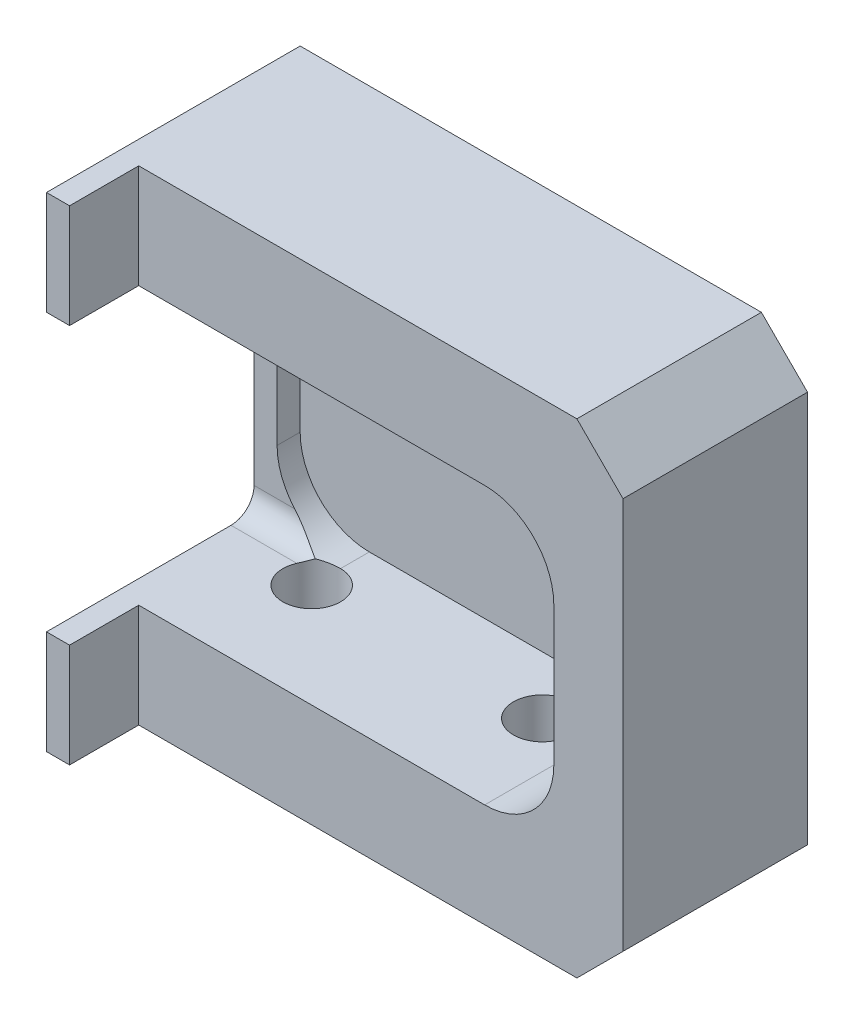
ISO-10303-21;
HEADER;
FILE_DESCRIPTION(('STEP AP214'),'2;1');
FILE_NAME('part.step','',(''),(''),'','','');
FILE_SCHEMA(('AUTOMOTIVE_DESIGN { 1 0 10303 214 1 1 1 1 }'));
ENDSEC;
DATA;
#1=APPLICATION_CONTEXT('core data for automotive mechanical design processes');
#2=APPLICATION_PROTOCOL_DEFINITION('international standard','automotive_design',2000,#1);
#3=PRODUCT_CONTEXT('',#1,'mechanical');
#4=PRODUCT('Part','Part','',(#3));
#5=PRODUCT_RELATED_PRODUCT_CATEGORY('part','',(#4));
#6=PRODUCT_DEFINITION_FORMATION('','',#4);
#7=PRODUCT_DEFINITION_CONTEXT('part definition',#1,'design');
#8=PRODUCT_DEFINITION('design','',#6,#7);
#9=PRODUCT_DEFINITION_SHAPE('','',#8);
#10=(LENGTH_UNIT() NAMED_UNIT(*) SI_UNIT(.MILLI.,.METRE.));
#11=(NAMED_UNIT(*) PLANE_ANGLE_UNIT() SI_UNIT($,.RADIAN.));
#12=(NAMED_UNIT(*) SI_UNIT($,.STERADIAN.) SOLID_ANGLE_UNIT());
#13=UNCERTAINTY_MEASURE_WITH_UNIT(LENGTH_MEASURE(1.E-05),#10,'distance_accuracy_value','');
#14=(GEOMETRIC_REPRESENTATION_CONTEXT(3) GLOBAL_UNCERTAINTY_ASSIGNED_CONTEXT((#13)) GLOBAL_UNIT_ASSIGNED_CONTEXT((#10,
#11,#12)) REPRESENTATION_CONTEXT('',''));
#15=CARTESIAN_POINT('',(0.,0.,0.));
#16=DIRECTION('',(0.,0.,1.));
#17=DIRECTION('',(1.,0.,0.));
#18=AXIS2_PLACEMENT_3D('',#15,#16,#17);
#19=CARTESIAN_POINT('',(-9.00000000000005,-3.00000000000005,1.00000000000005));
#20=DIRECTION('',(0.,0.,1.));
#21=DIRECTION('',(1.,0.,0.));
#22=AXIS2_PLACEMENT_3D('',#19,#20,#21);
#23=CYLINDRICAL_SURFACE('',#22,3.00000000000001);
#24=DIRECTION('',(0.,0.,1.));
#25=VECTOR('',#24,1.);
#26=CARTESIAN_POINT('',(-6.00000000000005,-3.00000000000001,1.00000000000005));
#27=LINE('',#26,#25);
#28=CARTESIAN_POINT('',(-6.00000000000005,-3.00000000000003,2.00000000000004));
#29=VERTEX_POINT('',#28);
#30=CARTESIAN_POINT('',(-6.00000000000002,-3.00000000000003,1.00000000000005));
#31=VERTEX_POINT('',#30);
#32=EDGE_CURVE('E194',#29,#31,#27,.F.);
#33=ORIENTED_EDGE('',*,*,#32,.T.);
#34=CARTESIAN_POINT('',(-9.00000000000005,-3.00000000000005,1.00000000000005));
#35=DIRECTION('',(0.,0.,1.));
#36=DIRECTION('',(1.,0.,0.));
#37=AXIS2_PLACEMENT_3D('',#34,#35,#36);
#38=CIRCLE('',#37,3.00000000000001);
#39=CARTESIAN_POINT('',(-9.00000000000005,-6.00000000000005,1.00000000000005));
#40=VERTEX_POINT('',#39);
#41=EDGE_CURVE('E215',#40,#31,#38,.T.);
#42=ORIENTED_EDGE('',*,*,#41,.F.);
#43=DIRECTION('',(0.,0.,1.));
#44=VECTOR('',#43,1.);
#45=CARTESIAN_POINT('',(-9.00000000000005,-6.00000000000006,1.00000000000005));
#46=LINE('',#45,#44);
#47=CARTESIAN_POINT('',(-9.00000000000005,-6.00000000000005,2.00000000000004));
#48=VERTEX_POINT('',#47);
#49=EDGE_CURVE('E196',#48,#40,#46,.F.);
#50=ORIENTED_EDGE('',*,*,#49,.F.);
#51=CARTESIAN_POINT('',(-9.00000000000005,-3.00000000000005,2.00000000000004));
#52=DIRECTION('',(0.,0.,1.));
#53=DIRECTION('',(1.,0.,0.));
#54=AXIS2_PLACEMENT_3D('',#51,#52,#53);
#55=CIRCLE('',#54,3.00000000000001);
#56=EDGE_CURVE('E19',#29,#48,#55,.F.);
#57=ORIENTED_EDGE('',*,*,#56,.F.);
#58=EDGE_LOOP('',(#33,#42,#50,#57));
#59=FACE_BOUND('',#58,.T.);
#60=ADVANCED_FACE('F16',(#59),#23,.F.);
#61=CARTESIAN_POINT('',(-6.00000000000005,2.99999999999998,1.00000000000005));
#62=DIRECTION('',(1.,0.,0.));
#63=DIRECTION('',(0.,1.,0.));
#64=AXIS2_PLACEMENT_3D('',#61,#62,#63);
#65=PLANE('',#64);
#66=DIRECTION('',(0.,0.,1.));
#67=VECTOR('',#66,1.);
#68=CARTESIAN_POINT('',(-6.00000000000004,2.99999999999995,1.00000000000005));
#69=LINE('',#68,#67);
#70=CARTESIAN_POINT('',(-6.00000000000004,2.99999999999995,2.00000000000005));
#71=VERTEX_POINT('',#70);
#72=CARTESIAN_POINT('',(-6.00000000000002,2.99999999999995,1.00000000000005));
#73=VERTEX_POINT('',#72);
#74=EDGE_CURVE('E210',#71,#73,#69,.F.);
#75=ORIENTED_EDGE('',*,*,#74,.T.);
#76=DIRECTION('',(0.,1.,0.));
#77=VECTOR('',#76,1.);
#78=CARTESIAN_POINT('',(-6.,-3.00000000000005,1.00000000000005));
#79=LINE('',#78,#77);
#80=EDGE_CURVE('E208',#31,#73,#79,.T.);
#81=ORIENTED_EDGE('',*,*,#80,.F.);
#82=ORIENTED_EDGE('',*,*,#32,.F.);
#83=DIRECTION('',(0.,1.,0.));
#84=VECTOR('',#83,1.);
#85=CARTESIAN_POINT('',(-6.00000000000005,-3.00000000000001,2.00000000000004));
#86=LINE('',#85,#84);
#87=EDGE_CURVE('E205',#71,#29,#86,.F.);
#88=ORIENTED_EDGE('',*,*,#87,.F.);
#89=EDGE_LOOP('',(#75,#81,#82,#88));
#90=FACE_BOUND('',#89,.T.);
#91=ADVANCED_FACE('F204',(#90),#65,.F.);
#92=CARTESIAN_POINT('',(-9.00000000000005,2.99999999999995,1.00000000000005));
#93=DIRECTION('',(0.,0.,1.));
#94=DIRECTION('',(1.,0.,0.));
#95=AXIS2_PLACEMENT_3D('',#92,#93,#94);
#96=CYLINDRICAL_SURFACE('',#95,3.00000000000001);
#97=DIRECTION('',(0.,0.,1.));
#98=VECTOR('',#97,1.);
#99=CARTESIAN_POINT('',(-9.00000000000005,5.99999999999996,1.00000000000005));
#100=LINE('',#99,#98);
#101=CARTESIAN_POINT('',(-9.00000000000005,5.99999999999997,1.00000000000005));
#102=VERTEX_POINT('',#101);
#103=CARTESIAN_POINT('',(-9.00000000000005,5.99999999999997,2.00000000000005));
#104=VERTEX_POINT('',#103);
#105=EDGE_CURVE('E201',#102,#104,#100,.T.);
#106=ORIENTED_EDGE('',*,*,#105,.F.);
#107=CARTESIAN_POINT('',(-9.00000000000005,2.99999999999995,1.00000000000005));
#108=DIRECTION('',(0.,0.,1.));
#109=DIRECTION('',(1.,0.,0.));
#110=AXIS2_PLACEMENT_3D('',#107,#108,#109);
#111=CIRCLE('',#110,3.00000000000001);
#112=EDGE_CURVE('E494',#73,#102,#111,.T.);
#113=ORIENTED_EDGE('',*,*,#112,.F.);
#114=ORIENTED_EDGE('',*,*,#74,.F.);
#115=CARTESIAN_POINT('',(-9.00000000000005,2.99999999999995,2.00000000000005));
#116=DIRECTION('',(0.,0.,1.));
#117=DIRECTION('',(1.,0.,0.));
#118=AXIS2_PLACEMENT_3D('',#115,#116,#117);
#119=CIRCLE('',#118,3.00000000000001);
#120=EDGE_CURVE('E200',#104,#71,#119,.F.);
#121=ORIENTED_EDGE('',*,*,#120,.F.);
#122=EDGE_LOOP('',(#106,#113,#114,#121));
#123=FACE_BOUND('',#122,.T.);
#124=ADVANCED_FACE('F369',(#123),#96,.F.);
#125=CARTESIAN_POINT('',(-6.00000000000001,-3.00000000000001,2.00000000000004));
#126=DIRECTION('',(0.,0.,1.));
#127=DIRECTION('',(1.,0.,0.));
#128=AXIS2_PLACEMENT_3D('',#125,#126,#127);
#129=PLANE('',#128);
#130=ORIENTED_EDGE('',*,*,#120,.T.);
#131=ORIENTED_EDGE('',*,*,#87,.T.);
#132=ORIENTED_EDGE('',*,*,#56,.T.);
#133=DIRECTION('',(1.,0.,0.));
#134=VECTOR('',#133,1.);
#135=CARTESIAN_POINT('',(-21.0000000000001,-6.00000000000005,2.00000000000005));
#136=LINE('',#135,#134);
#137=CARTESIAN_POINT('',(-6.00000000000003,-6.00000000000005,2.00000000000005));
#138=VERTEX_POINT('',#137);
#139=EDGE_CURVE('E238',#48,#138,#136,.T.);
#140=ORIENTED_EDGE('',*,*,#139,.T.);
#141=CARTESIAN_POINT('',(-6.00000000000001,-3.00000000000001,2.00000000000004));
#142=DIRECTION('',(0.,0.,1.));
#143=DIRECTION('',(1.,0.,0.));
#144=AXIS2_PLACEMENT_3D('',#141,#142,#143);
#145=CIRCLE('',#144,3.00000000000001);
#146=CARTESIAN_POINT('',(-3.,-3.00000000000001,2.00000000000002));
#147=VERTEX_POINT('',#146);
#148=EDGE_CURVE('E344',#138,#147,#145,.T.);
#149=ORIENTED_EDGE('',*,*,#148,.T.);
#150=DIRECTION('',(0.,1.,0.));
#151=VECTOR('',#150,1.);
#152=CARTESIAN_POINT('',(-3.,-3.,2.));
#153=LINE('',#152,#151);
#154=CARTESIAN_POINT('',(-3.00000000000002,2.99999999999998,2.));
#155=VERTEX_POINT('',#154);
#156=EDGE_CURVE('E245',#147,#155,#153,.T.);
#157=ORIENTED_EDGE('',*,*,#156,.T.);
#158=CARTESIAN_POINT('',(-6.00000000000005,2.99999999999998,2.));
#159=DIRECTION('',(0.,0.,1.));
#160=DIRECTION('',(1.,0.,0.));
#161=AXIS2_PLACEMENT_3D('',#158,#159,#160);
#162=CIRCLE('',#161,3.00000000000001);
#163=CARTESIAN_POINT('',(-6.00000000000007,5.99999999999999,2.00000000000003));
#164=VERTEX_POINT('',#163);
#165=EDGE_CURVE('E547',#155,#164,#162,.T.);
#166=ORIENTED_EDGE('',*,*,#165,.T.);
#167=DIRECTION('',(-1.,0.,0.));
#168=VECTOR('',#167,1.);
#169=CARTESIAN_POINT('',(-6.00000000000005,5.99999999999999,2.00000000000005));
#170=LINE('',#169,#168);
#171=EDGE_CURVE('E221',#164,#104,#170,.T.);
#172=ORIENTED_EDGE('',*,*,#171,.T.);
#173=EDGE_LOOP('',(#130,#131,#132,#140,#149,#157,#166,#172));
#174=FACE_BOUND('',#173,.T.);
#175=ADVANCED_FACE('F212',(#174),#129,.T.);
#176=CARTESIAN_POINT('',(-9.00000000000005,-3.00000000000005,1.00000000000005));
#177=DIRECTION('',(0.,0.,1.));
#178=DIRECTION('',(1.,0.,0.));
#179=AXIS2_PLACEMENT_3D('',#176,#177,#178);
#180=PLANE('',#179);
#181=DIRECTION('',(-1.,0.,0.));
#182=VECTOR('',#181,1.);
#183=CARTESIAN_POINT('',(-6.00000000000005,5.99999999999999,1.00000000000005));
#184=LINE('',#183,#182);
#185=CARTESIAN_POINT('',(-18.0000000000001,5.99999999999998,1.00000000000005));
#186=VERTEX_POINT('',#185);
#187=EDGE_CURVE('E223',#102,#186,#184,.T.);
#188=ORIENTED_EDGE('',*,*,#187,.T.);
#189=CARTESIAN_POINT('',(-18.0000000000001,3.,1.00000000000005));
#190=DIRECTION('',(0.,0.,-1.));
#191=DIRECTION('',(-1.,0.,0.));
#192=AXIS2_PLACEMENT_3D('',#189,#190,#191);
#193=CIRCLE('',#192,3.00000000000001);
#194=CARTESIAN_POINT('',(-21.0000000000001,3.,1.00000000000003));
#195=VERTEX_POINT('',#194);
#196=EDGE_CURVE('E348',#186,#195,#193,.F.);
#197=ORIENTED_EDGE('',*,*,#196,.T.);
#198=DIRECTION('',(0.,-1.,0.));
#199=VECTOR('',#198,1.);
#200=CARTESIAN_POINT('',(-21.0000000000001,-0.750000000000049,1.));
#201=LINE('',#200,#199);
#202=CARTESIAN_POINT('',(-21.0000000000001,-3.00000000000003,1.));
#203=VERTEX_POINT('',#202);
#204=EDGE_CURVE('E249',#195,#203,#201,.T.);
#205=ORIENTED_EDGE('',*,*,#204,.T.);
#206=CARTESIAN_POINT('',(-18.0000000000001,-3.,1.));
#207=DIRECTION('',(0.,0.,-1.));
#208=DIRECTION('',(-1.,0.,0.));
#209=AXIS2_PLACEMENT_3D('',#206,#207,#208);
#210=CIRCLE('',#209,3.00000000000001);
#211=CARTESIAN_POINT('',(-18.0000000000001,-6.00000000000005,1.00000000000003));
#212=VERTEX_POINT('',#211);
#213=EDGE_CURVE('E355',#203,#212,#210,.F.);
#214=ORIENTED_EDGE('',*,*,#213,.T.);
#215=DIRECTION('',(1.,0.,0.));
#216=VECTOR('',#215,1.);
#217=CARTESIAN_POINT('',(-21.0000000000001,-6.00000000000005,1.00000000000005));
#218=LINE('',#217,#216);
#219=EDGE_CURVE('E241',#212,#40,#218,.T.);
#220=ORIENTED_EDGE('',*,*,#219,.T.);
#221=ORIENTED_EDGE('',*,*,#41,.T.);
#222=ORIENTED_EDGE('',*,*,#80,.T.);
#223=ORIENTED_EDGE('',*,*,#112,.T.);
#224=EDGE_LOOP('',(#188,#197,#205,#214,#220,#221,#222,#223));
#225=FACE_BOUND('',#224,.T.);
#226=ADVANCED_FACE('F361',(#225),#180,.T.);
#227=CARTESIAN_POINT('',(-21.0000000000001,-5.00000000000005,3.));
#228=DIRECTION('',(-1.,0.,0.));
#229=DIRECTION('',(0.,-1.,0.));
#230=AXIS2_PLACEMENT_3D('',#227,#228,#229);
#231=CYLINDRICAL_SURFACE('',#230,1.);
#232=DIRECTION('',(1.,0.,0.));
#233=VECTOR('',#232,1.);
#234=CARTESIAN_POINT('',(-6.00000000000001,-5.00000000000005,2.00000000000004));
#235=LINE('',#234,#233);
#236=CARTESIAN_POINT('',(-22.0000000000001,-5.00000000000005,2.00000000000003));
#237=VERTEX_POINT('',#236);
#238=CARTESIAN_POINT('',(-20.2360679774999,-5.00000000000005,2.));
#239=VERTEX_POINT('',#238);
#240=EDGE_CURVE('E279',#237,#239,#235,.T.);
#241=ORIENTED_EDGE('',*,*,#240,.F.);
#242=CARTESIAN_POINT('',(-22.,-5.00000000000005,3.));
#243=DIRECTION('',(-1.,0.,0.));
#244=DIRECTION('',(0.,-1.,0.));
#245=AXIS2_PLACEMENT_3D('',#242,#243,#244);
#246=CIRCLE('',#245,1.);
#247=CARTESIAN_POINT('',(-22.0000000000001,-6.00000000000005,3.));
#248=VERTEX_POINT('',#247);
#249=EDGE_CURVE('E570',#248,#237,#246,.F.);
#250=ORIENTED_EDGE('',*,*,#249,.F.);
#251=DIRECTION('',(1.,0.,0.));
#252=VECTOR('',#251,1.);
#253=CARTESIAN_POINT('',(-21.0000000000001,-6.00000000000005,3.));
#254=LINE('',#253,#252);
#255=CARTESIAN_POINT('',(-19.145643923739,-6.00000000000003,3.00000000000001));
#256=VERTEX_POINT('',#255);
#257=EDGE_CURVE('E286',#248,#256,#254,.T.);
#258=ORIENTED_EDGE('',*,*,#257,.T.);
#259=CARTESIAN_POINT('',(-19.145643923739,-6.00000000000005,3.00000000000003));
#260=CARTESIAN_POINT('',(-19.1335860047608,-6.00000216471476,2.9723610569759));
#261=CARTESIAN_POINT('',(-19.1205337314216,-5.99885406798703,2.94519469398154));
#262=CARTESIAN_POINT('',(-19.0926011736499,-5.99451141686934,2.89203538061906));
#263=CARTESIAN_POINT('',(-19.0777235514878,-5.99131981491166,2.8660407951846));
#264=CARTESIAN_POINT('',(-19.0312448243982,-5.97923841222081,2.79117948311786));
#265=CARTESIAN_POINT('',(-18.9972410605997,-5.96781763555838,2.74417643710524));
#266=CARTESIAN_POINT('',(-18.936968961441,-5.94507011759203,2.67176859926564));
#267=CARTESIAN_POINT('',(-18.912211362201,-5.93513535403618,2.64459959512258));
#268=CARTESIAN_POINT('',(-18.8603567920642,-5.9136218621227,2.59244770382173));
#269=CARTESIAN_POINT('',(-18.8332311018124,-5.90202138192252,2.56750223452441));
#270=CARTESIAN_POINT('',(-18.8052014462808,-5.88992225343656,2.54388775193109));
#271=B_SPLINE_CURVE_WITH_KNOTS('',3,(#259,#260,#261,#262,#263,#264,#265,#266,#267,#268,#269,
#270),.UNSPECIFIED.,.F.,.F.,(4,2,2,2,2,4),(0.,0.0903626342465399,0.180595007321116,
0.356995467468432,0.471081409993196,0.586821862642563),.UNSPECIFIED.);
#272=CARTESIAN_POINT('',(-18.8052014462807,-5.88992225343654,2.54388775193106));
#273=VERTEX_POINT('',#272);
#274=EDGE_CURVE('E298',#256,#273,#271,.T.);
#275=ORIENTED_EDGE('',*,*,#274,.T.);
#276=CARTESIAN_POINT('',(-18.8052014462807,-5.88992225343653,2.54388775193102));
#277=CARTESIAN_POINT('',(-18.8766820764651,-5.86999806938938,2.50504695354408));
#278=CARTESIAN_POINT('',(-18.9478774791466,-5.84731037205621,2.46702152307443));
#279=CARTESIAN_POINT('',(-19.0896022252149,-5.79615279858999,2.39322900076842));
#280=CARTESIAN_POINT('',(-19.1601294143456,-5.76766836477693,2.35746789792917));
#281=CARTESIAN_POINT('',(-19.3014344819294,-5.70414169234751,2.28836227953853));
#282=CARTESIAN_POINT('',(-19.3721899117647,-5.66898128446031,2.25507927394703));
#283=CARTESIAN_POINT('',(-19.5120274950019,-5.59231988211007,2.19278691199239));
#284=CARTESIAN_POINT('',(-19.5811114815233,-5.550826236134,2.16377267820906));
#285=CARTESIAN_POINT('',(-19.7373177223271,-5.44803480548144,2.10344978332266));
#286=CARTESIAN_POINT('',(-19.823725201472,-5.38451076128947,2.07400488995049));
#287=CARTESIAN_POINT('',(-19.9906609914603,-5.24695336751685,2.02829815348217));
#288=CARTESIAN_POINT('',(-20.0712330874158,-5.17301408153891,2.01192622330429));
#289=CARTESIAN_POINT('',(-20.1628240687014,-5.07910096753086,2.00301375087773));
#290=CARTESIAN_POINT('',(-20.177686897228,-5.0635276818331,2.00189559050101));
#291=CARTESIAN_POINT('',(-20.2071122776573,-5.03202309782791,2.00038820086132));
#292=CARTESIAN_POINT('',(-20.2216743603619,-5.01609131082535,2.00000003633031));
#293=CARTESIAN_POINT('',(-20.2360679774999,-5.00000000000005,1.99999999999999));
#294=B_SPLINE_CURVE_WITH_KNOTS('',3,(#276,#277,#278,#279,#280,#281,#282,#283,#284,#285,#286,
#287,#288,#289,#290,#291,#292,#293),.UNSPECIFIED.,.F.,.F.,(4,2,2,2,2,2,2,2,4),(0.,
0.251270791183821,0.503180578055838,0.760054611723639,1.01663282772039,1.34917210944482,
1.67888064997109,1.74353789057764,1.80828936377438),.UNSPECIFIED.);
#295=EDGE_CURVE('E252',#273,#239,#294,.T.);
#296=ORIENTED_EDGE('',*,*,#295,.T.);
#297=EDGE_LOOP('',(#241,#250,#258,#275,#296));
#298=FACE_BOUND('',#297,.T.);
#299=ADVANCED_FACE('F357',(#298),#231,.F.);
#300=CARTESIAN_POINT('',(-18.0000000000001,-3.,2.00000000000005));
#301=DIRECTION('',(0.,0.,-1.));
#302=DIRECTION('',(-1.,0.,0.));
#303=AXIS2_PLACEMENT_3D('',#300,#301,#302);
#304=CYLINDRICAL_SURFACE('',#303,3.00000000000001);
#305=CARTESIAN_POINT('',(-18.0000000000001,-3.,2.));
#306=DIRECTION('',(0.,0.,-1.));
#307=DIRECTION('',(-1.,0.,0.));
#308=AXIS2_PLACEMENT_3D('',#305,#306,#307);
#309=CIRCLE('',#308,3.00000000000001);
#310=CARTESIAN_POINT('',(-21.0000000000001,-3.00000000000003,2.00000000000002));
#311=VERTEX_POINT('',#310);
#312=EDGE_CURVE('E276',#239,#311,#309,.T.);
#313=ORIENTED_EDGE('',*,*,#312,.F.);
#314=ORIENTED_EDGE('',*,*,#295,.F.);
#315=CARTESIAN_POINT('',(-18.8052014462808,-5.88992225343652,2.54388775193109));
#316=CARTESIAN_POINT('',(-18.7787705703172,-5.89728633885606,2.5216331572974));
#317=CARTESIAN_POINT('',(-18.7514134843442,-5.90451733762424,2.50046439406734));
#318=CARTESIAN_POINT('',(-18.6949455238834,-5.91854419594647,2.46040696236725));
#319=CARTESIAN_POINT('',(-18.6658335046846,-5.92533976538474,2.44151980680828));
#320=CARTESIAN_POINT('',(-18.5779449314347,-5.94439794063536,2.38959485726921));
#321=CARTESIAN_POINT('',(-18.5169385017218,-5.9558150082566,2.35988566539408));
#322=CARTESIAN_POINT('',(-18.418540236715,-5.97087582740997,2.32154370598238));
#323=CARTESIAN_POINT('',(-18.3826449760343,-5.97572369265541,2.30940196786504));
#324=CARTESIAN_POINT('',(-18.3097496956548,-5.98419154318239,2.28839287472527));
#325=CARTESIAN_POINT('',(-18.2727495849369,-5.98781142699573,2.27952579028233));
#326=CARTESIAN_POINT('',(-18.1966970828286,-5.9937954860243,2.26494545035855));
#327=CARTESIAN_POINT('',(-18.1576179679199,-5.99611190881352,2.259351860963));
#328=CARTESIAN_POINT('',(-18.0790280177229,-5.99921949931722,2.25187360449158));
#329=CARTESIAN_POINT('',(-18.0395169814076,-6.00000992349861,2.24999074543615));
#330=CARTESIAN_POINT('',(-18.0000000000001,-6.00000000000001,2.25000000000005));
#331=B_SPLINE_CURVE_WITH_KNOTS('',3,(#315,#316,#317,#318,#319,#320,#321,#322,#323,#324,#325,
#326,#327,#328,#329,#330),.UNSPECIFIED.,.F.,.F.,(4,2,2,2,2,2,2,4),(0.,0.105916137237498,
0.211902125314694,0.417223984747265,0.531686917209083,0.646159305448767,0.764590259164251,
0.883078903058867),.UNSPECIFIED.);
#332=CARTESIAN_POINT('',(-18.0000000000001,-6.00000000000003,2.25000000000005));
#333=VERTEX_POINT('',#332);
#334=EDGE_CURVE('E290',#273,#333,#331,.T.);
#335=ORIENTED_EDGE('',*,*,#334,.T.);
#336=DIRECTION('',(0.,0.,1.));
#337=VECTOR('',#336,1.);
#338=CARTESIAN_POINT('',(-18.0000000000001,-6.00000000000005,2.));
#339=LINE('',#338,#337);
#340=EDGE_CURVE('E244',#333,#212,#339,.F.);
#341=ORIENTED_EDGE('',*,*,#340,.T.);
#342=ORIENTED_EDGE('',*,*,#213,.F.);
#343=DIRECTION('',(0.,0.,1.));
#344=VECTOR('',#343,1.);
#345=CARTESIAN_POINT('',(-21.0000000000001,-3.00000000000005,2.));
#346=LINE('',#345,#344);
#347=EDGE_CURVE('E251',#203,#311,#346,.T.);
#348=ORIENTED_EDGE('',*,*,#347,.T.);
#349=EDGE_LOOP('',(#313,#314,#335,#341,#342,#348));
#350=FACE_BOUND('',#349,.T.);
#351=ADVANCED_FACE('F305',(#350),#304,.F.);
#352=CARTESIAN_POINT('',(-21.0000000000001,-0.750000000000049,2.));
#353=DIRECTION('',(-1.,0.,0.));
#354=DIRECTION('',(0.,-1.,0.));
#355=AXIS2_PLACEMENT_3D('',#352,#353,#354);
#356=PLANE('',#355);
#357=DIRECTION('',(0.,1.,0.));
#358=VECTOR('',#357,1.);
#359=CARTESIAN_POINT('',(-21.0000000000001,-3.00000000000001,2.00000000000004));
#360=LINE('',#359,#358);
#361=CARTESIAN_POINT('',(-21.0000000000001,3.,2.00000000000002));
#362=VERTEX_POINT('',#361);
#363=EDGE_CURVE('E275',#311,#362,#360,.T.);
#364=ORIENTED_EDGE('',*,*,#363,.F.);
#365=ORIENTED_EDGE('',*,*,#347,.F.);
#366=ORIENTED_EDGE('',*,*,#204,.F.);
#367=DIRECTION('',(0.,0.,-1.));
#368=VECTOR('',#367,1.);
#369=CARTESIAN_POINT('',(-21.0000000000001,3.,2.00000000000005));
#370=LINE('',#369,#368);
#371=EDGE_CURVE('E347',#195,#362,#370,.F.);
#372=ORIENTED_EDGE('',*,*,#371,.T.);
#373=EDGE_LOOP('',(#364,#365,#366,#372));
#374=FACE_BOUND('',#373,.T.);
#375=ADVANCED_FACE('F566',(#374),#356,.F.);
#376=CARTESIAN_POINT('',(-18.0000000000001,3.,2.00000000000005));
#377=DIRECTION('',(0.,0.,-1.));
#378=DIRECTION('',(-1.,0.,0.));
#379=AXIS2_PLACEMENT_3D('',#376,#377,#378);
#380=CYLINDRICAL_SURFACE('',#379,3.00000000000001);
#381=CARTESIAN_POINT('',(-20.2360679774999,4.99999999999998,2.00000000000004));
#382=CARTESIAN_POINT('',(-20.2077572937076,5.03165787721733,2.00000455551077));
#383=CARTESIAN_POINT('',(-20.1787885816353,5.06268744437713,2.00150263052102));
#384=CARTESIAN_POINT('',(-20.1197274162067,5.12333217250598,2.00716698518489));
#385=CARTESIAN_POINT('',(-20.0896364379922,5.15294908113631,2.0113298709754));
#386=CARTESIAN_POINT('',(-19.9983201473493,5.23912627426651,2.02726423180957));
#387=CARTESIAN_POINT('',(-19.935618835025,5.2934948471068,2.04249130920589));
#388=CARTESIAN_POINT('',(-19.7651445015376,5.42956135722896,2.09243701781798));
#389=CARTESIAN_POINT('',(-19.6548259454965,5.50574463309703,2.13338882471213));
#390=CARTESIAN_POINT('',(-19.4287723628823,5.64123727792299,2.22818730591386));
#391=CARTESIAN_POINT('',(-19.3130077259149,5.70043791408899,2.28211317833425));
#392=CARTESIAN_POINT('',(-19.1122851667142,5.78766892394679,2.38145907332452));
#393=CARTESIAN_POINT('',(-19.0280484674354,5.81976668088903,2.42486125147321));
#394=CARTESIAN_POINT('',(-18.8584871191477,5.87593200214769,2.51466433611601));
#395=CARTESIAN_POINT('',(-18.7731619436719,5.89999551480874,2.56106674158275));
#396=CARTESIAN_POINT('',(-18.5165620419713,5.96040290764698,2.70303658056613));
#397=CARTESIAN_POINT('',(-18.3440816394966,5.98521023345612,2.80166601959195));
#398=CARTESIAN_POINT('',(-18.1175431072368,5.99818404629853,2.93214230189497));
#399=CARTESIAN_POINT('',(-18.0635187811393,5.99981416628271,2.96332773520374));
#400=CARTESIAN_POINT('',(-18.0063245855041,5.99999499809153,2.99634849414617));
#401=CARTESIAN_POINT('',(-18.003162306191,5.99999999781966,2.99817423684781));
#402=CARTESIAN_POINT('',(-18.0000000000001,5.99999999999999,3.00000000000004));
#403=B_SPLINE_CURVE_WITH_KNOTS('',3,(#381,#382,#383,#384,#385,#386,#387,#388,#389,#390,#391,
#392,#393,#394,#395,#396,#397,#398,#399,#400,#401,#402),.UNSPECIFIED.,.F.,.F.,(4,2,2,2,2,2,2,2,
2,2,4),(0.,0.127328124372468,0.254494407315152,0.506902758847987,0.925154347493572,
1.3460269287566,1.64578712718793,1.94569826663518,2.5434478271798,2.73062158792373,
2.74157604934413),.UNSPECIFIED.);
#404=CARTESIAN_POINT('',(-18.0000000000001,5.99999999999998,3.00000000000005));
#405=VERTEX_POINT('',#404);
#406=CARTESIAN_POINT('',(-20.2360679774999,4.99999999999997,2.00000000000002));
#407=VERTEX_POINT('',#406);
#408=EDGE_CURVE('E337',#405,#407,#403,.F.);
#409=ORIENTED_EDGE('',*,*,#408,.T.);
#410=CARTESIAN_POINT('',(-18.0000000000001,3.,2.));
#411=DIRECTION('',(0.,0.,-1.));
#412=DIRECTION('',(-1.,0.,0.));
#413=AXIS2_PLACEMENT_3D('',#410,#411,#412);
#414=CIRCLE('',#413,3.00000000000001);
#415=EDGE_CURVE('E271',#362,#407,#414,.T.);
#416=ORIENTED_EDGE('',*,*,#415,.F.);
#417=ORIENTED_EDGE('',*,*,#371,.F.);
#418=ORIENTED_EDGE('',*,*,#196,.F.);
#419=DIRECTION('',(0.,0.,1.));
#420=VECTOR('',#419,1.);
#421=CARTESIAN_POINT('',(-18.0000000000001,5.99999999999998,2.00000000000005));
#422=LINE('',#421,#420);
#423=EDGE_CURVE('E487',#186,#405,#422,.T.);
#424=ORIENTED_EDGE('',*,*,#423,.T.);
#425=EDGE_LOOP('',(#409,#416,#417,#418,#424));
#426=FACE_BOUND('',#425,.T.);
#427=ADVANCED_FACE('F333',(#426),#380,.F.);
#428=CARTESIAN_POINT('',(-6.00000000000005,4.99999999999998,3.00000000000004));
#429=DIRECTION('',(-1.,0.,0.));
#430=DIRECTION('',(0.,-1.,0.));
#431=AXIS2_PLACEMENT_3D('',#428,#429,#430);
#432=CYLINDRICAL_SURFACE('',#431,1.);
#433=DIRECTION('',(-1.,0.,0.));
#434=VECTOR('',#433,1.);
#435=CARTESIAN_POINT('',(-6.00000000000005,5.99999999999999,3.00000000000005));
#436=LINE('',#435,#434);
#437=CARTESIAN_POINT('',(-22.0000000000001,5.99999999999997,3.00000000000005));
#438=VERTEX_POINT('',#437);
#439=EDGE_CURVE('E488',#405,#438,#436,.T.);
#440=ORIENTED_EDGE('',*,*,#439,.T.);
#441=CARTESIAN_POINT('',(-22.0000000000001,4.99999999999998,3.00000000000004));
#442=DIRECTION('',(-1.,0.,0.));
#443=DIRECTION('',(0.,-1.,0.));
#444=AXIS2_PLACEMENT_3D('',#441,#442,#443);
#445=CIRCLE('',#444,1.);
#446=CARTESIAN_POINT('',(-22.0000000000001,4.99999999999997,2.00000000000002));
#447=VERTEX_POINT('',#446);
#448=EDGE_CURVE('E345',#447,#438,#445,.F.);
#449=ORIENTED_EDGE('',*,*,#448,.F.);
#450=DIRECTION('',(1.,0.,0.));
#451=VECTOR('',#450,1.);
#452=CARTESIAN_POINT('',(-6.00000000000001,4.99999999999996,2.00000000000004));
#453=LINE('',#452,#451);
#454=EDGE_CURVE('E274',#407,#447,#453,.F.);
#455=ORIENTED_EDGE('',*,*,#454,.F.);
#456=ORIENTED_EDGE('',*,*,#408,.F.);
#457=EDGE_LOOP('',(#440,#449,#455,#456));
#458=FACE_BOUND('',#457,.T.);
#459=ADVANCED_FACE('F328',(#458),#432,.F.);
#460=CARTESIAN_POINT('',(-6.00000000000001,-3.00000000000001,2.00000000000004));
#461=DIRECTION('',(0.,0.,1.));
#462=DIRECTION('',(1.,0.,0.));
#463=AXIS2_PLACEMENT_3D('',#460,#461,#462);
#464=CYLINDRICAL_SURFACE('',#463,3.00000000000001);
#465=DIRECTION('',(0.,0.,1.));
#466=VECTOR('',#465,1.);
#467=CARTESIAN_POINT('',(-3.,-3.,2.));
#468=LINE('',#467,#466);
#469=CARTESIAN_POINT('',(-3.00000000000002,-3.00000000000001,8.00000000000001));
#470=VERTEX_POINT('',#469);
#471=EDGE_CURVE('E248',#470,#147,#468,.F.);
#472=ORIENTED_EDGE('',*,*,#471,.T.);
#473=ORIENTED_EDGE('',*,*,#148,.F.);
#474=DIRECTION('',(0.,0.,1.));
#475=VECTOR('',#474,1.);
#476=CARTESIAN_POINT('',(-6.00000000000005,-6.00000000000005,2.));
#477=LINE('',#476,#475);
#478=CARTESIAN_POINT('',(-6.00000000000003,-6.00000000000005,8.00000000000001));
#479=VERTEX_POINT('',#478);
#480=EDGE_CURVE('E240',#138,#479,#477,.T.);
#481=ORIENTED_EDGE('',*,*,#480,.T.);
#482=CARTESIAN_POINT('',(-6.00000000000001,-3.00000000000001,8.00000000000001));
#483=DIRECTION('',(0.,0.,1.));
#484=DIRECTION('',(1.,0.,0.));
#485=AXIS2_PLACEMENT_3D('',#482,#483,#484);
#486=CIRCLE('',#485,3.00000000000001);
#487=EDGE_CURVE('E268',#479,#470,#486,.T.);
#488=ORIENTED_EDGE('',*,*,#487,.T.);
#489=EDGE_LOOP('',(#472,#473,#481,#488));
#490=FACE_BOUND('',#489,.T.);
#491=ADVANCED_FACE('F324',(#490),#464,.F.);
#492=CARTESIAN_POINT('',(-3.,-3.,2.));
#493=DIRECTION('',(1.,0.,0.));
#494=DIRECTION('',(0.,1.,0.));
#495=AXIS2_PLACEMENT_3D('',#492,#493,#494);
#496=PLANE('',#495);
#497=DIRECTION('',(0.,0.,1.));
#498=VECTOR('',#497,1.);
#499=CARTESIAN_POINT('',(-3.00000000000004,2.99999999999998,2.00000000000005));
#500=LINE('',#499,#498);
#501=CARTESIAN_POINT('',(-3.00000000000004,2.99999999999998,8.00000000000003));
#502=VERTEX_POINT('',#501);
#503=EDGE_CURVE('E247',#502,#155,#500,.F.);
#504=ORIENTED_EDGE('',*,*,#503,.T.);
#505=ORIENTED_EDGE('',*,*,#156,.F.);
#506=ORIENTED_EDGE('',*,*,#471,.F.);
#507=DIRECTION('',(0.,1.,0.));
#508=VECTOR('',#507,1.);
#509=CARTESIAN_POINT('',(-3.00000000000004,10.5,8.00000000000001));
#510=LINE('',#509,#508);
#511=EDGE_CURVE('E267',#470,#502,#510,.T.);
#512=ORIENTED_EDGE('',*,*,#511,.T.);
#513=EDGE_LOOP('',(#504,#505,#506,#512));
#514=FACE_BOUND('',#513,.T.);
#515=ADVANCED_FACE('F320',(#514),#496,.F.);
#516=CARTESIAN_POINT('',(-6.00000000000005,2.99999999999998,2.00000000000005));
#517=DIRECTION('',(0.,0.,1.));
#518=DIRECTION('',(1.,0.,0.));
#519=AXIS2_PLACEMENT_3D('',#516,#517,#518);
#520=CYLINDRICAL_SURFACE('',#519,3.00000000000001);
#521=DIRECTION('',(0.,0.,1.));
#522=VECTOR('',#521,1.);
#523=CARTESIAN_POINT('',(-6.0000000000001,5.99999999999999,2.00000000000005));
#524=LINE('',#523,#522);
#525=CARTESIAN_POINT('',(-6.00000000000007,5.99999999999996,8.00000000000003));
#526=VERTEX_POINT('',#525);
#527=EDGE_CURVE('E224',#526,#164,#524,.F.);
#528=ORIENTED_EDGE('',*,*,#527,.T.);
#529=ORIENTED_EDGE('',*,*,#165,.F.);
#530=ORIENTED_EDGE('',*,*,#503,.F.);
#531=CARTESIAN_POINT('',(-6.00000000000005,2.99999999999998,8.00000000000005));
#532=DIRECTION('',(0.,0.,1.));
#533=DIRECTION('',(1.,0.,0.));
#534=AXIS2_PLACEMENT_3D('',#531,#532,#533);
#535=CIRCLE('',#534,3.00000000000001);
#536=EDGE_CURVE('E264',#502,#526,#535,.T.);
#537=ORIENTED_EDGE('',*,*,#536,.T.);
#538=EDGE_LOOP('',(#528,#529,#530,#537));
#539=FACE_BOUND('',#538,.T.);
#540=ADVANCED_FACE('F314',(#539),#520,.F.);
#541=CARTESIAN_POINT('',(-18.0000000000001,-10.5,3.50000000000004));
#542=DIRECTION('',(0.,-1.,0.));
#543=DIRECTION('',(1.,0.,0.));
#544=AXIS2_PLACEMENT_3D('',#541,#542,#543);
#545=CYLINDRICAL_SURFACE('',#544,1.24999999999999);
#546=CARTESIAN_POINT('',(-18.0000000000001,-6.00000000000002,3.50000000000004));
#547=DIRECTION('',(0.,-1.,0.));
#548=DIRECTION('',(1.,0.,0.));
#549=AXIS2_PLACEMENT_3D('',#546,#547,#548);
#550=CIRCLE('',#549,1.24999999999999);
#551=EDGE_CURVE('E283',#256,#333,#550,.F.);
#552=ORIENTED_EDGE('',*,*,#551,.T.);
#553=ORIENTED_EDGE('',*,*,#334,.F.);
#554=ORIENTED_EDGE('',*,*,#274,.F.);
#555=EDGE_LOOP('',(#552,#553,#554));
#556=FACE_BOUND('',#555,.T.);
#557=CARTESIAN_POINT('',(-18.0000000000001,-10.5,3.50000000000004));
#558=DIRECTION('',(0.,-1.,0.));
#559=DIRECTION('',(1.,0.,0.));
#560=AXIS2_PLACEMENT_3D('',#557,#558,#559);
#561=CIRCLE('',#560,1.24999999999999);
#562=CARTESIAN_POINT('',(-16.7500000000001,-10.5,3.50000000000004));
#563=VERTEX_POINT('',#562);
#564=EDGE_CURVE('E260',#563,#563,#561,.T.);
#565=ORIENTED_EDGE('',*,*,#564,.T.);
#566=EDGE_LOOP('',(#565));
#567=FACE_BOUND('',#566,.T.);
#568=ADVANCED_FACE('F308',(#556,#567),#545,.F.);
#569=CARTESIAN_POINT('',(-8.00000000000004,-10.5000000000001,3.5));
#570=DIRECTION('',(0.,-1.,0.));
#571=DIRECTION('',(1.,0.,0.));
#572=AXIS2_PLACEMENT_3D('',#569,#570,#571);
#573=CYLINDRICAL_SURFACE('',#572,1.24999999999999);
#574=CARTESIAN_POINT('',(-8.00000000000004,-6.00000000000005,3.5));
#575=DIRECTION('',(0.,-1.,0.));
#576=DIRECTION('',(1.,0.,0.));
#577=AXIS2_PLACEMENT_3D('',#574,#575,#576);
#578=CIRCLE('',#577,1.24999999999999);
#579=CARTESIAN_POINT('',(-6.75000000000005,-6.00000000000005,3.5));
#580=VERTEX_POINT('',#579);
#581=EDGE_CURVE('E280',#580,#580,#578,.F.);
#582=ORIENTED_EDGE('',*,*,#581,.T.);
#583=EDGE_LOOP('',(#582));
#584=FACE_BOUND('',#583,.T.);
#585=CARTESIAN_POINT('',(-8.00000000000004,-10.5000000000001,3.5));
#586=DIRECTION('',(0.,-1.,0.));
#587=DIRECTION('',(1.,0.,0.));
#588=AXIS2_PLACEMENT_3D('',#585,#586,#587);
#589=CIRCLE('',#588,1.24999999999999);
#590=CARTESIAN_POINT('',(-6.75000000000005,-10.5000000000001,3.5));
#591=VERTEX_POINT('',#590);
#592=EDGE_CURVE('E256',#591,#591,#589,.T.);
#593=ORIENTED_EDGE('',*,*,#592,.T.);
#594=EDGE_LOOP('',(#593));
#595=FACE_BOUND('',#594,.T.);
#596=ADVANCED_FACE('F313',(#584,#595),#573,.F.);
#597=CARTESIAN_POINT('',(-21.0000000000001,-0.750000000000049,2.));
#598=DIRECTION('',(-1.,0.,0.));
#599=DIRECTION('',(0.,-1.,0.));
#600=AXIS2_PLACEMENT_3D('',#597,#598,#599);
#601=PLANE('',#600);
#602=DIRECTION('',(0.,0.,1.));
#603=VECTOR('',#602,1.);
#604=CARTESIAN_POINT('',(-21.0000000000001,-6.00000000000005,2.));
#605=LINE('',#604,#603);
#606=CARTESIAN_POINT('',(-21.0000000000001,-6.00000000000005,8.00000000000001));
#607=VERTEX_POINT('',#606);
#608=CARTESIAN_POINT('',(-21.0000000000001,-6.00000000000005,11.0000000000001));
#609=VERTEX_POINT('',#608);
#610=EDGE_CURVE('E289',#607,#609,#605,.T.);
#611=ORIENTED_EDGE('',*,*,#610,.T.);
#612=DIRECTION('',(0.,1.,0.));
#613=VECTOR('',#612,1.);
#614=CARTESIAN_POINT('',(-21.0000000000001,-10.5,11.0000000000001));
#615=LINE('',#614,#613);
#616=CARTESIAN_POINT('',(-21.0000000000001,-10.5,11.));
#617=VERTEX_POINT('',#616);
#618=EDGE_CURVE('E232',#609,#617,#615,.F.);
#619=ORIENTED_EDGE('',*,*,#618,.T.);
#620=DIRECTION('',(0.,0.,1.));
#621=VECTOR('',#620,1.);
#622=CARTESIAN_POINT('',(-21.0000000000001,-10.5,8.));
#623=LINE('',#622,#621);
#624=CARTESIAN_POINT('',(-21.0000000000001,-10.5,8.00000000000001));
#625=VERTEX_POINT('',#624);
#626=EDGE_CURVE('E462',#617,#625,#623,.F.);
#627=ORIENTED_EDGE('',*,*,#626,.T.);
#628=DIRECTION('',(0.,1.,0.));
#629=VECTOR('',#628,1.);
#630=CARTESIAN_POINT('',(-21.0000000000001,10.5,8.00000000000001));
#631=LINE('',#630,#629);
#632=EDGE_CURVE('E447',#625,#607,#631,.T.);
#633=ORIENTED_EDGE('',*,*,#632,.T.);
#634=EDGE_LOOP('',(#611,#619,#627,#633));
#635=FACE_BOUND('',#634,.T.);
#636=ADVANCED_FACE('F434',(#635),#601,.F.);
#637=CARTESIAN_POINT('',(-21.0000000000001,-6.00000000000005,2.));
#638=DIRECTION('',(0.,-1.,0.));
#639=DIRECTION('',(1.,0.,0.));
#640=AXIS2_PLACEMENT_3D('',#637,#638,#639);
#641=PLANE('',#640);
#642=ORIENTED_EDGE('',*,*,#581,.F.);
#643=EDGE_LOOP('',(#642));
#644=FACE_BOUND('',#643,.T.);
#645=ORIENTED_EDGE('',*,*,#551,.F.);
#646=ORIENTED_EDGE('',*,*,#257,.F.);
#647=DIRECTION('',(0.,0.,1.));
#648=VECTOR('',#647,1.);
#649=CARTESIAN_POINT('',(-22.0000000000001,-6.00000000000005,8.));
#650=LINE('',#649,#648);
#651=CARTESIAN_POINT('',(-22.0000000000001,-6.00000000000005,11.0000000000001));
#652=VERTEX_POINT('',#651);
#653=EDGE_CURVE('E455',#248,#652,#650,.T.);
#654=ORIENTED_EDGE('',*,*,#653,.T.);
#655=DIRECTION('',(-1.,0.,0.));
#656=VECTOR('',#655,1.);
#657=CARTESIAN_POINT('',(-21.0000000000001,-6.00000000000005,11.0000000000001));
#658=LINE('',#657,#656);
#659=EDGE_CURVE('E235',#652,#609,#658,.F.);
#660=ORIENTED_EDGE('',*,*,#659,.T.);
#661=ORIENTED_EDGE('',*,*,#610,.F.);
#662=DIRECTION('',(-1.,0.,0.));
#663=VECTOR('',#662,1.);
#664=CARTESIAN_POINT('',(-22.0000000000001,-6.00000000000005,8.00000000000001));
#665=LINE('',#664,#663);
#666=EDGE_CURVE('E270',#607,#479,#665,.F.);
#667=ORIENTED_EDGE('',*,*,#666,.T.);
#668=ORIENTED_EDGE('',*,*,#480,.F.);
#669=ORIENTED_EDGE('',*,*,#139,.F.);
#670=ORIENTED_EDGE('',*,*,#49,.T.);
#671=ORIENTED_EDGE('',*,*,#219,.F.);
#672=ORIENTED_EDGE('',*,*,#340,.F.);
#673=EDGE_LOOP('',(#645,#646,#654,#660,#661,#667,#668,#669,#670,#671,#672));
#674=FACE_BOUND('',#673,.T.);
#675=ADVANCED_FACE('F431',(#644,#674),#641,.F.);
#676=CARTESIAN_POINT('',(-21.0000000000001,-10.5,11.0000000000001));
#677=DIRECTION('',(0.,0.,-1.));
#678=DIRECTION('',(-1.,0.,0.));
#679=AXIS2_PLACEMENT_3D('',#676,#677,#678);
#680=PLANE('',#679);
#681=ORIENTED_EDGE('',*,*,#659,.F.);
#682=DIRECTION('',(0.,1.,0.));
#683=VECTOR('',#682,1.);
#684=CARTESIAN_POINT('',(-22.0000000000001,-10.5,11.0000000000001));
#685=LINE('',#684,#683);
#686=CARTESIAN_POINT('',(-22.0000000000001,-10.5,11.));
#687=VERTEX_POINT('',#686);
#688=EDGE_CURVE('E460',#652,#687,#685,.F.);
#689=ORIENTED_EDGE('',*,*,#688,.T.);
#690=DIRECTION('',(-1.,0.,0.));
#691=VECTOR('',#690,1.);
#692=CARTESIAN_POINT('',(0.,-10.5,11.));
#693=LINE('',#692,#691);
#694=EDGE_CURVE('E259',#687,#617,#693,.F.);
#695=ORIENTED_EDGE('',*,*,#694,.T.);
#696=ORIENTED_EDGE('',*,*,#618,.F.);
#697=EDGE_LOOP('',(#681,#689,#695,#696));
#698=FACE_BOUND('',#697,.T.);
#699=ADVANCED_FACE('F427',(#698),#680,.F.);
#700=CARTESIAN_POINT('',(-21.0000000000001,10.5,11.0000000000001));
#701=DIRECTION('',(0.,0.,1.));
#702=DIRECTION('',(1.,0.,0.));
#703=AXIS2_PLACEMENT_3D('',#700,#701,#702);
#704=PLANE('',#703);
#705=DIRECTION('',(1.,0.,0.));
#706=VECTOR('',#705,1.);
#707=CARTESIAN_POINT('',(-21.0000000000001,10.5,11.0000000000001));
#708=LINE('',#707,#706);
#709=CARTESIAN_POINT('',(-21.0000000000001,10.5,11.0000000000001));
#710=VERTEX_POINT('',#709);
#711=CARTESIAN_POINT('',(-22.0000000000001,10.5,11.0000000000001));
#712=VERTEX_POINT('',#711);
#713=EDGE_CURVE('E234',#710,#712,#708,.F.);
#714=ORIENTED_EDGE('',*,*,#713,.T.);
#715=DIRECTION('',(0.,1.,0.));
#716=VECTOR('',#715,1.);
#717=CARTESIAN_POINT('',(-22.0000000000001,-10.5,11.0000000000001));
#718=LINE('',#717,#716);
#719=CARTESIAN_POINT('',(-22.0000000000001,5.99999999999996,11.0000000000001));
#720=VERTEX_POINT('',#719);
#721=EDGE_CURVE('E515',#712,#720,#718,.F.);
#722=ORIENTED_EDGE('',*,*,#721,.T.);
#723=DIRECTION('',(-1.,0.,0.));
#724=VECTOR('',#723,1.);
#725=CARTESIAN_POINT('',(-6.00000000000005,5.99999999999999,11.0000000000001));
#726=LINE('',#725,#724);
#727=CARTESIAN_POINT('',(-21.0000000000001,5.99999999999996,11.0000000000001));
#728=VERTEX_POINT('',#727);
#729=EDGE_CURVE('E511',#720,#728,#726,.F.);
#730=ORIENTED_EDGE('',*,*,#729,.T.);
#731=DIRECTION('',(0.,-1.,0.));
#732=VECTOR('',#731,1.);
#733=CARTESIAN_POINT('',(-21.0000000000001,-0.750000000000049,11.0000000000001));
#734=LINE('',#733,#732);
#735=EDGE_CURVE('E479',#728,#710,#734,.F.);
#736=ORIENTED_EDGE('',*,*,#735,.T.);
#737=EDGE_LOOP('',(#714,#722,#730,#736));
#738=FACE_BOUND('',#737,.T.);
#739=ADVANCED_FACE('F423',(#738),#704,.T.);
#740=CARTESIAN_POINT('',(-6.00000000000005,5.99999999999999,2.00000000000005));
#741=DIRECTION('',(0.,1.,0.));
#742=DIRECTION('',(-1.,0.,0.));
#743=AXIS2_PLACEMENT_3D('',#740,#741,#742);
#744=PLANE('',#743);
#745=ORIENTED_EDGE('',*,*,#439,.F.);
#746=ORIENTED_EDGE('',*,*,#423,.F.);
#747=ORIENTED_EDGE('',*,*,#187,.F.);
#748=ORIENTED_EDGE('',*,*,#105,.T.);
#749=ORIENTED_EDGE('',*,*,#171,.F.);
#750=ORIENTED_EDGE('',*,*,#527,.F.);
#751=DIRECTION('',(-1.,0.,0.));
#752=VECTOR('',#751,1.);
#753=CARTESIAN_POINT('',(-22.0000000000001,5.99999999999996,8.00000000000001));
#754=LINE('',#753,#752);
#755=CARTESIAN_POINT('',(-21.0000000000001,5.99999999999995,8.00000000000001));
#756=VERTEX_POINT('',#755);
#757=EDGE_CURVE('E266',#526,#756,#754,.T.);
#758=ORIENTED_EDGE('',*,*,#757,.T.);
#759=DIRECTION('',(0.,0.,1.));
#760=VECTOR('',#759,1.);
#761=CARTESIAN_POINT('',(-21.0000000000001,5.99999999999995,2.));
#762=LINE('',#761,#760);
#763=EDGE_CURVE('E482',#756,#728,#762,.T.);
#764=ORIENTED_EDGE('',*,*,#763,.T.);
#765=ORIENTED_EDGE('',*,*,#729,.F.);
#766=DIRECTION('',(0.,0.,1.));
#767=VECTOR('',#766,1.);
#768=CARTESIAN_POINT('',(-22.0000000000001,5.99999999999995,8.));
#769=LINE('',#768,#767);
#770=EDGE_CURVE('E505',#720,#438,#769,.F.);
#771=ORIENTED_EDGE('',*,*,#770,.T.);
#772=EDGE_LOOP('',(#745,#746,#747,#748,#749,#750,#758,#764,#765,#771));
#773=FACE_BOUND('',#772,.T.);
#774=ADVANCED_FACE('F419',(#773),#744,.F.);
#775=CARTESIAN_POINT('',(-6.00000000000001,-3.00000000000001,2.00000000000004));
#776=DIRECTION('',(0.,0.,1.));
#777=DIRECTION('',(1.,0.,0.));
#778=AXIS2_PLACEMENT_3D('',#775,#776,#777);
#779=PLANE('',#778);
#780=ORIENTED_EDGE('',*,*,#415,.T.);
#781=ORIENTED_EDGE('',*,*,#454,.T.);
#782=DIRECTION('',(0.,1.,0.));
#783=VECTOR('',#782,1.);
#784=CARTESIAN_POINT('',(-22.0000000000001,-10.5,2.));
#785=LINE('',#784,#783);
#786=EDGE_CURVE('E229',#447,#237,#785,.F.);
#787=ORIENTED_EDGE('',*,*,#786,.T.);
#788=ORIENTED_EDGE('',*,*,#240,.T.);
#789=ORIENTED_EDGE('',*,*,#312,.T.);
#790=ORIENTED_EDGE('',*,*,#363,.T.);
#791=EDGE_LOOP('',(#780,#781,#787,#788,#789,#790));
#792=FACE_BOUND('',#791,.T.);
#793=ADVANCED_FACE('F415',(#792),#779,.T.);
#794=CARTESIAN_POINT('',(-21.0000000000001,-0.750000000000049,2.));
#795=DIRECTION('',(-1.,0.,0.));
#796=DIRECTION('',(0.,-1.,0.));
#797=AXIS2_PLACEMENT_3D('',#794,#795,#796);
#798=PLANE('',#797);
#799=ORIENTED_EDGE('',*,*,#763,.F.);
#800=DIRECTION('',(0.,1.,0.));
#801=VECTOR('',#800,1.);
#802=CARTESIAN_POINT('',(-21.0000000000001,10.5,8.00000000000001));
#803=LINE('',#802,#801);
#804=CARTESIAN_POINT('',(-21.0000000000001,10.5,8.00000000000004));
#805=VERTEX_POINT('',#804);
#806=EDGE_CURVE('E540',#756,#805,#803,.T.);
#807=ORIENTED_EDGE('',*,*,#806,.T.);
#808=DIRECTION('',(0.,0.,1.));
#809=VECTOR('',#808,1.);
#810=CARTESIAN_POINT('',(-21.0000000000001,10.5,8.00000000000001));
#811=LINE('',#810,#809);
#812=EDGE_CURVE('E225',#805,#710,#811,.T.);
#813=ORIENTED_EDGE('',*,*,#812,.T.);
#814=ORIENTED_EDGE('',*,*,#735,.F.);
#815=EDGE_LOOP('',(#799,#807,#813,#814));
#816=FACE_BOUND('',#815,.T.);
#817=ADVANCED_FACE('F411',(#816),#798,.F.);
#818=CARTESIAN_POINT('',(-22.0000000000001,10.5,8.00000000000001));
#819=DIRECTION('',(0.,0.,-1.));
#820=DIRECTION('',(-1.,0.,0.));
#821=AXIS2_PLACEMENT_3D('',#818,#819,#820);
#822=PLANE('',#821);
#823=ORIENTED_EDGE('',*,*,#757,.F.);
#824=ORIENTED_EDGE('',*,*,#536,.F.);
#825=ORIENTED_EDGE('',*,*,#511,.F.);
#826=ORIENTED_EDGE('',*,*,#487,.F.);
#827=ORIENTED_EDGE('',*,*,#666,.F.);
#828=ORIENTED_EDGE('',*,*,#632,.F.);
#829=DIRECTION('',(-1.,0.,0.));
#830=VECTOR('',#829,1.);
#831=CARTESIAN_POINT('',(0.,-10.5,8.));
#832=LINE('',#831,#830);
#833=CARTESIAN_POINT('',(-2.00000000000006,-10.5,8.00000000000002));
#834=VERTEX_POINT('',#833);
#835=EDGE_CURVE('E467',#625,#834,#832,.F.);
#836=ORIENTED_EDGE('',*,*,#835,.T.);
#837=DIRECTION('',(-0.70710678118655,-0.707106781186545,0.));
#838=VECTOR('',#837,1.);
#839=CARTESIAN_POINT('',(0.,-8.49999999999999,8.00000000000005));
#840=LINE('',#839,#838);
#841=CARTESIAN_POINT('',(0.,-8.49999999999998,8.00000000000002));
#842=VERTEX_POINT('',#841);
#843=EDGE_CURVE('E263',#834,#842,#840,.F.);
#844=ORIENTED_EDGE('',*,*,#843,.T.);
#845=DIRECTION('',(0.,-1.,0.));
#846=VECTOR('',#845,1.);
#847=CARTESIAN_POINT('',(0.,10.5,8.));
#848=LINE('',#847,#846);
#849=CARTESIAN_POINT('',(0.,8.49999999999999,8.));
#850=VERTEX_POINT('',#849);
#851=EDGE_CURVE('E542',#842,#850,#848,.F.);
#852=ORIENTED_EDGE('',*,*,#851,.T.);
#853=DIRECTION('',(0.707106781186547,-0.707106781186548,0.));
#854=VECTOR('',#853,1.);
#855=CARTESIAN_POINT('',(-2.00000000000005,10.5,8.));
#856=LINE('',#855,#854);
#857=CARTESIAN_POINT('',(-2.00000000000001,10.5,8.00000000000003));
#858=VERTEX_POINT('',#857);
#859=EDGE_CURVE('E601',#850,#858,#856,.F.);
#860=ORIENTED_EDGE('',*,*,#859,.T.);
#861=DIRECTION('',(1.,0.,0.));
#862=VECTOR('',#861,1.);
#863=CARTESIAN_POINT('',(-22.0000000000001,10.5,8.00000000000005));
#864=LINE('',#863,#862);
#865=EDGE_CURVE('E524',#858,#805,#864,.F.);
#866=ORIENTED_EDGE('',*,*,#865,.T.);
#867=ORIENTED_EDGE('',*,*,#806,.F.);
#868=EDGE_LOOP('',(#823,#824,#825,#826,#827,#828,#836,#844,#852,#860,#866,#867));
#869=FACE_BOUND('',#868,.T.);
#870=ADVANCED_FACE('F407',(#869),#822,.F.);
#871=CARTESIAN_POINT('',(0.,10.5,8.00000000000001));
#872=DIRECTION('',(-1.,0.,0.));
#873=DIRECTION('',(0.,-1.,0.));
#874=AXIS2_PLACEMENT_3D('',#871,#872,#873);
#875=PLANE('',#874);
#876=DIRECTION('',(0.,0.,1.));
#877=VECTOR('',#876,1.);
#878=CARTESIAN_POINT('',(0.,-8.49999999999999,8.));
#879=LINE('',#878,#877);
#880=CARTESIAN_POINT('',(0.,-8.49999999999999,0.));
#881=VERTEX_POINT('',#880);
#882=EDGE_CURVE('E586',#842,#881,#879,.F.);
#883=ORIENTED_EDGE('',*,*,#882,.T.);
#884=DIRECTION('',(0.,1.,0.));
#885=VECTOR('',#884,1.);
#886=CARTESIAN_POINT('',(0.,10.5,0.));
#887=LINE('',#886,#885);
#888=CARTESIAN_POINT('',(0.,8.49999999999999,0.));
#889=VERTEX_POINT('',#888);
#890=EDGE_CURVE('E617',#889,#881,#887,.F.);
#891=ORIENTED_EDGE('',*,*,#890,.F.);
#892=DIRECTION('',(0.,0.,1.));
#893=VECTOR('',#892,1.);
#894=CARTESIAN_POINT('',(0.,8.49999999999997,8.00000000000005));
#895=LINE('',#894,#893);
#896=EDGE_CURVE('E621',#889,#850,#895,.T.);
#897=ORIENTED_EDGE('',*,*,#896,.T.);
#898=ORIENTED_EDGE('',*,*,#851,.F.);
#899=EDGE_LOOP('',(#883,#891,#897,#898));
#900=FACE_BOUND('',#899,.T.);
#901=ADVANCED_FACE('F403',(#900),#875,.F.);
#902=CARTESIAN_POINT('',(0.,-8.49999999999999,8.));
#903=DIRECTION('',(-0.707106781186545,0.70710678118655,0.));
#904=DIRECTION('',(-0.70710678118655,-0.707106781186545,0.));
#905=AXIS2_PLACEMENT_3D('',#902,#903,#904);
#906=PLANE('',#905);
#907=DIRECTION('',(0.,0.,1.));
#908=VECTOR('',#907,1.);
#909=CARTESIAN_POINT('',(-2.00000000000006,-10.5,8.));
#910=LINE('',#909,#908);
#911=CARTESIAN_POINT('',(-2.00000000000004,-10.5,0.));
#912=VERTEX_POINT('',#911);
#913=EDGE_CURVE('E469',#834,#912,#910,.F.);
#914=ORIENTED_EDGE('',*,*,#913,.T.);
#915=DIRECTION('',(-0.707106781186549,-0.707106781186546,0.));
#916=VECTOR('',#915,1.);
#917=CARTESIAN_POINT('',(0.,-8.49999999999999,0.));
#918=LINE('',#917,#916);
#919=EDGE_CURVE('E613',#881,#912,#918,.T.);
#920=ORIENTED_EDGE('',*,*,#919,.F.);
#921=ORIENTED_EDGE('',*,*,#882,.F.);
#922=ORIENTED_EDGE('',*,*,#843,.F.);
#923=EDGE_LOOP('',(#914,#920,#921,#922));
#924=FACE_BOUND('',#923,.T.);
#925=ADVANCED_FACE('F399',(#924),#906,.F.);
#926=CARTESIAN_POINT('',(0.,-10.5,8.));
#927=DIRECTION('',(0.,1.,0.));
#928=DIRECTION('',(-1.,0.,0.));
#929=AXIS2_PLACEMENT_3D('',#926,#927,#928);
#930=PLANE('',#929);
#931=ORIENTED_EDGE('',*,*,#913,.F.);
#932=ORIENTED_EDGE('',*,*,#835,.F.);
#933=ORIENTED_EDGE('',*,*,#626,.F.);
#934=ORIENTED_EDGE('',*,*,#694,.F.);
#935=DIRECTION('',(0.,0.,1.));
#936=VECTOR('',#935,1.);
#937=CARTESIAN_POINT('',(-22.0000000000001,-10.5,8.));
#938=LINE('',#937,#936);
#939=CARTESIAN_POINT('',(-22.0000000000001,-10.5,0.));
#940=VERTEX_POINT('',#939);
#941=EDGE_CURVE('E517',#687,#940,#938,.F.);
#942=ORIENTED_EDGE('',*,*,#941,.T.);
#943=DIRECTION('',(-1.,0.,0.));
#944=VECTOR('',#943,1.);
#945=CARTESIAN_POINT('',(-22.0000000000001,-10.5,0.));
#946=LINE('',#945,#944);
#947=EDGE_CURVE('E611',#912,#940,#946,.T.);
#948=ORIENTED_EDGE('',*,*,#947,.F.);
#949=EDGE_LOOP('',(#931,#932,#933,#934,#942,#948));
#950=FACE_BOUND('',#949,.T.);
#951=ORIENTED_EDGE('',*,*,#592,.F.);
#952=EDGE_LOOP('',(#951));
#953=FACE_BOUND('',#952,.T.);
#954=ORIENTED_EDGE('',*,*,#564,.F.);
#955=EDGE_LOOP('',(#954));
#956=FACE_BOUND('',#955,.T.);
#957=ADVANCED_FACE('F395',(#950,#953,#956),#930,.F.);
#958=CARTESIAN_POINT('',(-22.0000000000001,-10.5,8.));
#959=DIRECTION('',(1.,0.,0.));
#960=DIRECTION('',(0.,1.,0.));
#961=AXIS2_PLACEMENT_3D('',#958,#959,#960);
#962=PLANE('',#961);
#963=ORIENTED_EDGE('',*,*,#448,.T.);
#964=ORIENTED_EDGE('',*,*,#770,.F.);
#965=ORIENTED_EDGE('',*,*,#721,.F.);
#966=DIRECTION('',(0.,0.,1.));
#967=VECTOR('',#966,1.);
#968=CARTESIAN_POINT('',(-22.0000000000001,10.5,8.00000000000001));
#969=LINE('',#968,#967);
#970=CARTESIAN_POINT('',(-22.0000000000001,10.5,0.));
#971=VERTEX_POINT('',#970);
#972=EDGE_CURVE('E228',#712,#971,#969,.F.);
#973=ORIENTED_EDGE('',*,*,#972,.T.);
#974=DIRECTION('',(0.,1.,0.));
#975=VECTOR('',#974,1.);
#976=CARTESIAN_POINT('',(-22.0000000000001,10.5,0.));
#977=LINE('',#976,#975);
#978=EDGE_CURVE('E606',#940,#971,#977,.T.);
#979=ORIENTED_EDGE('',*,*,#978,.F.);
#980=ORIENTED_EDGE('',*,*,#941,.F.);
#981=ORIENTED_EDGE('',*,*,#688,.F.);
#982=ORIENTED_EDGE('',*,*,#653,.F.);
#983=ORIENTED_EDGE('',*,*,#249,.T.);
#984=ORIENTED_EDGE('',*,*,#786,.F.);
#985=EDGE_LOOP('',(#963,#964,#965,#973,#979,#980,#981,#982,#983,#984));
#986=FACE_BOUND('',#985,.T.);
#987=ADVANCED_FACE('F392',(#986),#962,.F.);
#988=CARTESIAN_POINT('',(-22.0000000000001,10.5,8.00000000000001));
#989=DIRECTION('',(0.,-1.,0.));
#990=DIRECTION('',(1.,0.,0.));
#991=AXIS2_PLACEMENT_3D('',#988,#989,#990);
#992=PLANE('',#991);
#993=DIRECTION('',(0.,0.,1.));
#994=VECTOR('',#993,1.);
#995=CARTESIAN_POINT('',(-2.00000000000005,10.5,8.00000000000005));
#996=LINE('',#995,#994);
#997=CARTESIAN_POINT('',(-2.,10.5,0.));
#998=VERTEX_POINT('',#997);
#999=EDGE_CURVE('E34',#858,#998,#996,.F.);
#1000=ORIENTED_EDGE('',*,*,#999,.T.);
#1001=DIRECTION('',(-1.,0.,0.));
#1002=VECTOR('',#1001,1.);
#1003=CARTESIAN_POINT('',(-22.0000000000001,10.5,0.));
#1004=LINE('',#1003,#1002);
#1005=EDGE_CURVE('E25',#971,#998,#1004,.F.);
#1006=ORIENTED_EDGE('',*,*,#1005,.F.);
#1007=ORIENTED_EDGE('',*,*,#972,.F.);
#1008=ORIENTED_EDGE('',*,*,#713,.F.);
#1009=ORIENTED_EDGE('',*,*,#812,.F.);
#1010=ORIENTED_EDGE('',*,*,#865,.F.);
#1011=EDGE_LOOP('',(#1000,#1006,#1007,#1008,#1009,#1010));
#1012=FACE_BOUND('',#1011,.T.);
#1013=ADVANCED_FACE('F385',(#1012),#992,.F.);
#1014=CARTESIAN_POINT('',(-2.00000000000005,10.5,8.00000000000005));
#1015=DIRECTION('',(-0.707106781186548,-0.707106781186547,0.));
#1016=DIRECTION('',(0.707106781186547,-0.707106781186548,0.));
#1017=AXIS2_PLACEMENT_3D('',#1014,#1015,#1016);
#1018=PLANE('',#1017);
#1019=ORIENTED_EDGE('',*,*,#896,.F.);
#1020=DIRECTION('',(0.707106781186546,-0.707106781186549,0.));
#1021=VECTOR('',#1020,1.);
#1022=CARTESIAN_POINT('',(-1.99999999999999,10.5,0.));
#1023=LINE('',#1022,#1021);
#1024=EDGE_CURVE('E11',#998,#889,#1023,.T.);
#1025=ORIENTED_EDGE('',*,*,#1024,.F.);
#1026=ORIENTED_EDGE('',*,*,#999,.F.);
#1027=ORIENTED_EDGE('',*,*,#859,.F.);
#1028=EDGE_LOOP('',(#1019,#1025,#1026,#1027));
#1029=FACE_BOUND('',#1028,.T.);
#1030=ADVANCED_FACE('F379',(#1029),#1018,.F.);
#1031=CARTESIAN_POINT('',(-22.0000000000001,10.5,0.));
#1032=DIRECTION('',(0.,0.,-1.));
#1033=DIRECTION('',(-1.,0.,0.));
#1034=AXIS2_PLACEMENT_3D('',#1031,#1032,#1033);
#1035=PLANE('',#1034);
#1036=ORIENTED_EDGE('',*,*,#1005,.T.);
#1037=ORIENTED_EDGE('',*,*,#1024,.T.);
#1038=ORIENTED_EDGE('',*,*,#890,.T.);
#1039=ORIENTED_EDGE('',*,*,#919,.T.);
#1040=ORIENTED_EDGE('',*,*,#947,.T.);
#1041=ORIENTED_EDGE('',*,*,#978,.T.);
#1042=EDGE_LOOP('',(#1036,#1037,#1038,#1039,#1040,#1041));
#1043=FACE_BOUND('',#1042,.T.);
#1044=ADVANCED_FACE('F377',(#1043),#1035,.T.);
#1045=CLOSED_SHELL('',(#60,#91,#124,#175,#226,#299,#351,#375,#427,#459,#491,#515,#540,#568,#596,
#636,#675,#699,#739,#774,#793,#817,#870,#901,#925,#957,#987,#1013,#1030,#1044));
#1046=MANIFOLD_SOLID_BREP('B1',#1045);
#1047=ADVANCED_BREP_SHAPE_REPRESENTATION('',(#18,#1046),#14);
#1048=SHAPE_DEFINITION_REPRESENTATION(#9,#1047);
ENDSEC;
END-ISO-10303-21;
